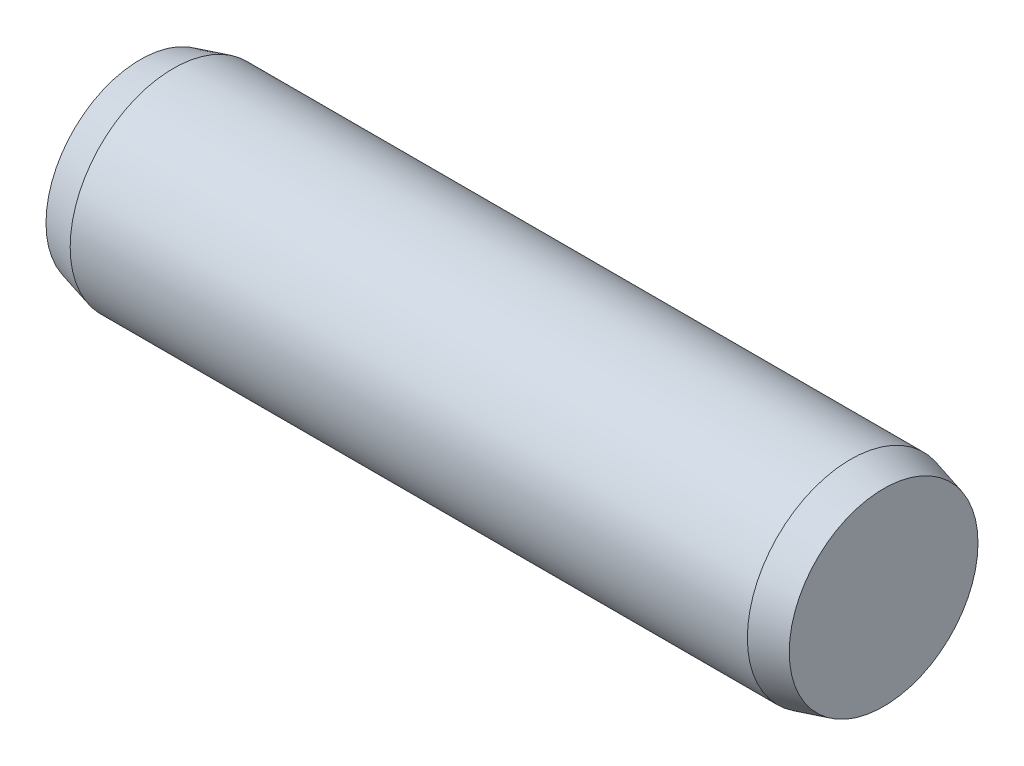
ISO-10303-21;
HEADER;
FILE_DESCRIPTION(('STEP AP214'),'2;1');
FILE_NAME('part.step','',(''),(''),'','','');
FILE_SCHEMA(('AUTOMOTIVE_DESIGN { 1 0 10303 214 1 1 1 1 }'));
ENDSEC;
DATA;
#1=APPLICATION_CONTEXT('core data for automotive mechanical design processes');
#2=APPLICATION_PROTOCOL_DEFINITION('international standard','automotive_design',2000,#1);
#3=PRODUCT_CONTEXT('',#1,'mechanical');
#4=PRODUCT('Part','Part','',(#3));
#5=PRODUCT_RELATED_PRODUCT_CATEGORY('part','',(#4));
#6=PRODUCT_DEFINITION_FORMATION('','',#4);
#7=PRODUCT_DEFINITION_CONTEXT('part definition',#1,'design');
#8=PRODUCT_DEFINITION('design','',#6,#7);
#9=PRODUCT_DEFINITION_SHAPE('','',#8);
#10=(LENGTH_UNIT() NAMED_UNIT(*) SI_UNIT(.MILLI.,.METRE.));
#11=(NAMED_UNIT(*) PLANE_ANGLE_UNIT() SI_UNIT($,.RADIAN.));
#12=(NAMED_UNIT(*) SI_UNIT($,.STERADIAN.) SOLID_ANGLE_UNIT());
#13=UNCERTAINTY_MEASURE_WITH_UNIT(LENGTH_MEASURE(1.E-05),#10,'distance_accuracy_value','');
#14=(GEOMETRIC_REPRESENTATION_CONTEXT(3) GLOBAL_UNCERTAINTY_ASSIGNED_CONTEXT((#13)) GLOBAL_UNIT_ASSIGNED_CONTEXT((#10,
#11,#12)) REPRESENTATION_CONTEXT('',''));
#15=CARTESIAN_POINT('',(0.,0.,0.));
#16=DIRECTION('',(0.,0.,1.));
#17=DIRECTION('',(1.,0.,0.));
#18=AXIS2_PLACEMENT_3D('',#15,#16,#17);
#19=CARTESIAN_POINT('',(18.,0.,0.));
#20=DIRECTION('',(-1.,0.,0.));
#21=DIRECTION('',(0.,0.,1.));
#22=AXIS2_PLACEMENT_3D('',#19,#20,#21);
#23=PLANE('',#22);
#24=CARTESIAN_POINT('',(18.0000000000291,0.,0.));
#25=DIRECTION('',(-1.,0.,0.));
#26=DIRECTION('',(0.,0.,1.));
#27=AXIS2_PLACEMENT_3D('',#24,#25,#26);
#28=CIRCLE('',#27,2.28564064602414);
#29=CARTESIAN_POINT('',(18.0000000000291,0.,2.28564064602414));
#30=VERTEX_POINT('',#29);
#31=EDGE_CURVE('E17',#30,#30,#28,.T.);
#32=ORIENTED_EDGE('',*,*,#31,.F.);
#33=EDGE_LOOP('',(#32));
#34=FACE_BOUND('',#33,.T.);
#35=ADVANCED_FACE('F14',(#34),#23,.F.);
#36=CARTESIAN_POINT('',(0.,2.2856406460551,0.));
#37=DIRECTION('',(1.,0.,0.));
#38=DIRECTION('',(0.,0.,-1.));
#39=AXIS2_PLACEMENT_3D('',#36,#37,#38);
#40=PLANE('',#39);
#41=CARTESIAN_POINT('',(5.6843418860808E-11,0.,0.));
#42=DIRECTION('',(1.,0.,0.));
#43=DIRECTION('',(0.,0.,-1.));
#44=AXIS2_PLACEMENT_3D('',#41,#42,#43);
#45=CIRCLE('',#44,2.28564064608303);
#46=CARTESIAN_POINT('',(5.6843418860808E-11,0.,-2.28564064608303));
#47=VERTEX_POINT('',#46);
#48=EDGE_CURVE('E26',#47,#47,#45,.T.);
#49=ORIENTED_EDGE('',*,*,#48,.F.);
#50=EDGE_LOOP('',(#49));
#51=FACE_BOUND('',#50,.T.);
#52=ADVANCED_FACE('F37',(#51),#40,.F.);
#53=CARTESIAN_POINT('',(17.2000000000594,0.,0.));
#54=DIRECTION('',(-1.,0.,0.));
#55=DIRECTION('',(0.,0.,1.));
#56=AXIS2_PLACEMENT_3D('',#53,#54,#55);
#57=CONICAL_SURFACE('',#56,2.4999999999693,0.261799387808921);
#58=CARTESIAN_POINT('',(17.2,0.,0.));
#59=DIRECTION('',(-1.,0.,0.));
#60=DIRECTION('',(0.,0.,1.));
#61=AXIS2_PLACEMENT_3D('',#58,#59,#60);
#62=CIRCLE('',#61,2.5);
#63=CARTESIAN_POINT('',(17.2,0.,2.5));
#64=VERTEX_POINT('',#63);
#65=EDGE_CURVE('E21',#64,#64,#62,.T.);
#66=ORIENTED_EDGE('',*,*,#65,.F.);
#67=EDGE_LOOP('',(#66));
#68=FACE_BOUND('',#67,.T.);
#69=ORIENTED_EDGE('',*,*,#31,.T.);
#70=EDGE_LOOP('',(#69));
#71=FACE_BOUND('',#70,.T.);
#72=ADVANCED_FACE('F34',(#68,#71),#57,.T.);
#73=CARTESIAN_POINT('',(0.79999999991287,0.,0.));
#74=DIRECTION('',(1.,0.,0.));
#75=DIRECTION('',(0.,0.,-1.));
#76=AXIS2_PLACEMENT_3D('',#73,#74,#75);
#77=CONICAL_SURFACE('',#76,2.4999999999693,0.261799387775774);
#78=CARTESIAN_POINT('',(0.8,0.,0.));
#79=DIRECTION('',(-1.,0.,0.));
#80=DIRECTION('',(0.,0.,1.));
#81=AXIS2_PLACEMENT_3D('',#78,#79,#80);
#82=CIRCLE('',#81,2.5);
#83=CARTESIAN_POINT('',(0.8,0.,2.5));
#84=VERTEX_POINT('',#83);
#85=EDGE_CURVE('E10',#84,#84,#82,.F.);
#86=ORIENTED_EDGE('',*,*,#85,.F.);
#87=EDGE_LOOP('',(#86));
#88=FACE_BOUND('',#87,.T.);
#89=ORIENTED_EDGE('',*,*,#48,.T.);
#90=EDGE_LOOP('',(#89));
#91=FACE_BOUND('',#90,.T.);
#92=ADVANCED_FACE('F45',(#88,#91),#77,.T.);
#93=CARTESIAN_POINT('',(-6.35,0.,0.));
#94=DIRECTION('',(-1.,0.,0.));
#95=DIRECTION('',(0.,0.,1.));
#96=AXIS2_PLACEMENT_3D('',#93,#94,#95);
#97=CYLINDRICAL_SURFACE('',#96,2.5);
#98=ORIENTED_EDGE('',*,*,#85,.T.);
#99=EDGE_LOOP('',(#98));
#100=FACE_BOUND('',#99,.T.);
#101=ORIENTED_EDGE('',*,*,#65,.T.);
#102=EDGE_LOOP('',(#101));
#103=FACE_BOUND('',#102,.T.);
#104=ADVANCED_FACE('F43',(#100,#103),#97,.T.);
#105=CLOSED_SHELL('',(#35,#52,#72,#92,#104));
#106=MANIFOLD_SOLID_BREP('B1',#105);
#107=ADVANCED_BREP_SHAPE_REPRESENTATION('',(#18,#106),#14);
#108=SHAPE_DEFINITION_REPRESENTATION(#9,#107);
ENDSEC;
END-ISO-10303-21;
